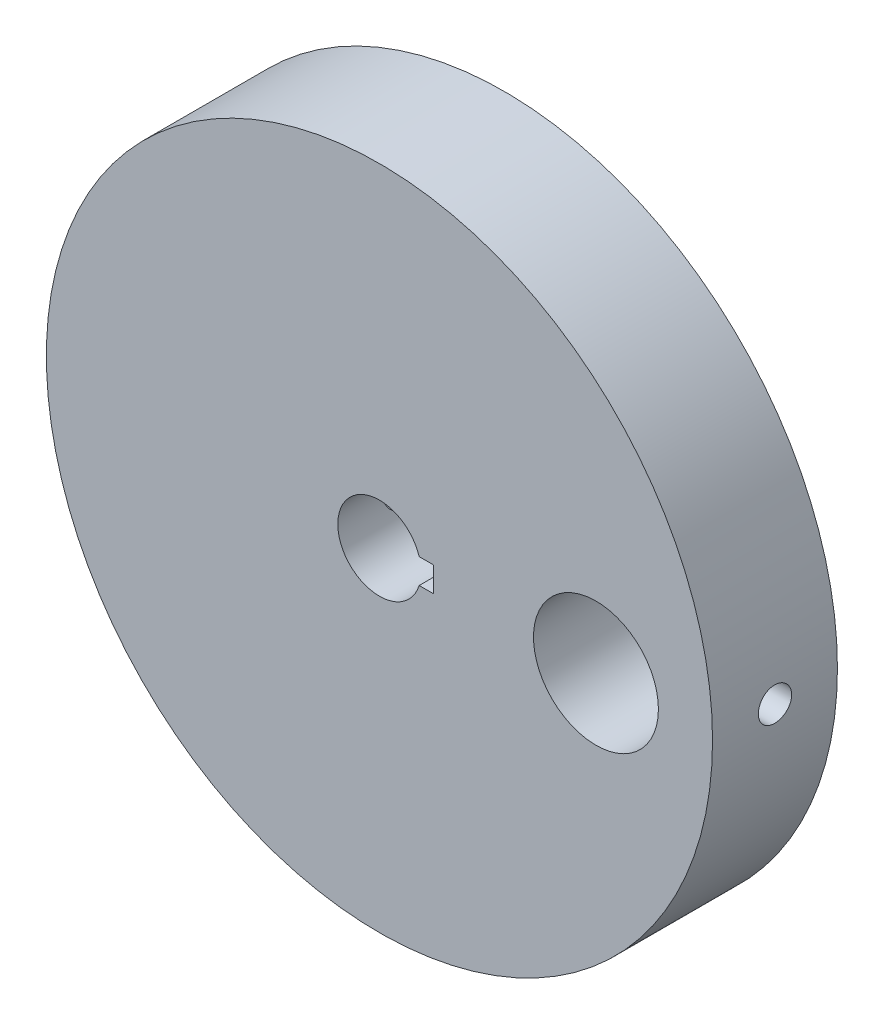
ISO-10303-21;
HEADER;
FILE_DESCRIPTION(('STEP AP214'),'2;1');
FILE_NAME('part.step','',(''),(''),'','','');
FILE_SCHEMA(('AUTOMOTIVE_DESIGN { 1 0 10303 214 1 1 1 1 }'));
ENDSEC;
DATA;
#1=APPLICATION_CONTEXT('core data for automotive mechanical design processes');
#2=APPLICATION_PROTOCOL_DEFINITION('international standard','automotive_design',2000,#1);
#3=PRODUCT_CONTEXT('',#1,'mechanical');
#4=PRODUCT('Part','Part','',(#3));
#5=PRODUCT_RELATED_PRODUCT_CATEGORY('part','',(#4));
#6=PRODUCT_DEFINITION_FORMATION('','',#4);
#7=PRODUCT_DEFINITION_CONTEXT('part definition',#1,'design');
#8=PRODUCT_DEFINITION('design','',#6,#7);
#9=PRODUCT_DEFINITION_SHAPE('','',#8);
#10=(LENGTH_UNIT() NAMED_UNIT(*) SI_UNIT(.MILLI.,.METRE.));
#11=(NAMED_UNIT(*) PLANE_ANGLE_UNIT() SI_UNIT($,.RADIAN.));
#12=(NAMED_UNIT(*) SI_UNIT($,.STERADIAN.) SOLID_ANGLE_UNIT());
#13=UNCERTAINTY_MEASURE_WITH_UNIT(LENGTH_MEASURE(1.E-05),#10,'distance_accuracy_value','');
#14=(GEOMETRIC_REPRESENTATION_CONTEXT(3) GLOBAL_UNCERTAINTY_ASSIGNED_CONTEXT((#13)) GLOBAL_UNIT_ASSIGNED_CONTEXT((#10,
#11,#12)) REPRESENTATION_CONTEXT('',''));
#15=CARTESIAN_POINT('',(0.,0.,0.));
#16=DIRECTION('',(0.,0.,1.));
#17=DIRECTION('',(1.,0.,0.));
#18=AXIS2_PLACEMENT_3D('',#15,#16,#17);
#19=CARTESIAN_POINT('',(0.,0.,7.5));
#20=DIRECTION('',(0.,0.,1.));
#21=DIRECTION('',(1.,0.,0.));
#22=AXIS2_PLACEMENT_3D('',#19,#20,#21);
#23=PLANE('',#22);
#24=CARTESIAN_POINT('',(0.,0.,7.5));
#25=DIRECTION('',(0.,0.,1.));
#26=DIRECTION('',(1.,0.,0.));
#27=AXIS2_PLACEMENT_3D('',#24,#25,#26);
#28=CIRCLE('',#27,40.);
#29=CARTESIAN_POINT('',(40.,0.,7.5));
#30=VERTEX_POINT('',#29);
#31=EDGE_CURVE('E11',#30,#30,#28,.T.);
#32=ORIENTED_EDGE('',*,*,#31,.T.);
#33=EDGE_LOOP('',(#32));
#34=FACE_BOUND('',#33,.T.);
#35=CARTESIAN_POINT('',(26.,0.,7.5));
#36=DIRECTION('',(0.,0.,1.));
#37=DIRECTION('',(1.,0.,0.));
#38=AXIS2_PLACEMENT_3D('',#35,#36,#37);
#39=CIRCLE('',#38,7.5);
#40=CARTESIAN_POINT('',(33.5,0.,7.5));
#41=VERTEX_POINT('',#40);
#42=EDGE_CURVE('E116',#41,#41,#39,.T.);
#43=ORIENTED_EDGE('',*,*,#42,.F.);
#44=EDGE_LOOP('',(#43));
#45=FACE_BOUND('',#44,.T.);
#46=DIRECTION('',(1.,0.,0.));
#47=VECTOR('',#46,1.);
#48=CARTESIAN_POINT('',(4.76969600708473,-1.5,7.5));
#49=LINE('',#48,#47);
#50=CARTESIAN_POINT('',(4.76969600708473,-1.5,7.5));
#51=VERTEX_POINT('',#50);
#52=CARTESIAN_POINT('',(6.5,-1.5,7.5));
#53=VERTEX_POINT('',#52);
#54=EDGE_CURVE('E86',#51,#53,#49,.T.);
#55=ORIENTED_EDGE('',*,*,#54,.F.);
#56=CARTESIAN_POINT('',(0.,0.,7.5));
#57=DIRECTION('',(0.,0.,1.));
#58=DIRECTION('',(1.,0.,0.));
#59=AXIS2_PLACEMENT_3D('',#56,#57,#58);
#60=CIRCLE('',#59,5.);
#61=CARTESIAN_POINT('',(4.76969600708473,1.5,7.5));
#62=VERTEX_POINT('',#61);
#63=EDGE_CURVE('E78',#62,#51,#60,.T.);
#64=ORIENTED_EDGE('',*,*,#63,.F.);
#65=DIRECTION('',(-1.,0.,0.));
#66=VECTOR('',#65,1.);
#67=CARTESIAN_POINT('',(4.76969600708473,1.5,7.5));
#68=LINE('',#67,#66);
#69=CARTESIAN_POINT('',(6.5,1.5,7.5));
#70=VERTEX_POINT('',#69);
#71=EDGE_CURVE('E100',#70,#62,#68,.T.);
#72=ORIENTED_EDGE('',*,*,#71,.F.);
#73=DIRECTION('',(0.,1.,0.));
#74=VECTOR('',#73,1.);
#75=CARTESIAN_POINT('',(6.5,1.5,7.5));
#76=LINE('',#75,#74);
#77=EDGE_CURVE('E98',#53,#70,#76,.T.);
#78=ORIENTED_EDGE('',*,*,#77,.F.);
#79=EDGE_LOOP('',(#55,#64,#72,#78));
#80=FACE_BOUND('',#79,.T.);
#81=ADVANCED_FACE('F37',(#34,#45,#80),#23,.T.);
#82=CARTESIAN_POINT('',(0.,0.,-7.5));
#83=DIRECTION('',(0.,0.,1.));
#84=DIRECTION('',(1.,0.,0.));
#85=AXIS2_PLACEMENT_3D('',#82,#83,#84);
#86=PLANE('',#85);
#87=CARTESIAN_POINT('',(26.,0.,-7.5));
#88=DIRECTION('',(0.,0.,1.));
#89=DIRECTION('',(1.,0.,0.));
#90=AXIS2_PLACEMENT_3D('',#87,#88,#89);
#91=CIRCLE('',#90,7.5);
#92=CARTESIAN_POINT('',(33.5,0.,-7.5));
#93=VERTEX_POINT('',#92);
#94=EDGE_CURVE('E94',#93,#93,#91,.T.);
#95=ORIENTED_EDGE('',*,*,#94,.T.);
#96=EDGE_LOOP('',(#95));
#97=FACE_BOUND('',#96,.T.);
#98=CARTESIAN_POINT('',(0.,0.,-7.5));
#99=DIRECTION('',(0.,0.,1.));
#100=DIRECTION('',(1.,0.,0.));
#101=AXIS2_PLACEMENT_3D('',#98,#99,#100);
#102=CIRCLE('',#101,40.);
#103=CARTESIAN_POINT('',(40.,0.,-7.5));
#104=VERTEX_POINT('',#103);
#105=EDGE_CURVE('E41',#104,#104,#102,.T.);
#106=ORIENTED_EDGE('',*,*,#105,.F.);
#107=EDGE_LOOP('',(#106));
#108=FACE_BOUND('',#107,.T.);
#109=CARTESIAN_POINT('',(0.,0.,-7.5));
#110=DIRECTION('',(0.,0.,1.));
#111=DIRECTION('',(1.,0.,0.));
#112=AXIS2_PLACEMENT_3D('',#109,#110,#111);
#113=CIRCLE('',#112,5.);
#114=CARTESIAN_POINT('',(4.76969600708473,1.5,-7.5));
#115=VERTEX_POINT('',#114);
#116=CARTESIAN_POINT('',(4.76969600708473,-1.5,-7.5));
#117=VERTEX_POINT('',#116);
#118=EDGE_CURVE('E60',#115,#117,#113,.T.);
#119=ORIENTED_EDGE('',*,*,#118,.T.);
#120=DIRECTION('',(1.,0.,0.));
#121=VECTOR('',#120,1.);
#122=CARTESIAN_POINT('',(4.76969600708473,-1.5,-7.5));
#123=LINE('',#122,#121);
#124=CARTESIAN_POINT('',(6.5,-1.5,-7.5));
#125=VERTEX_POINT('',#124);
#126=EDGE_CURVE('E93',#117,#125,#123,.T.);
#127=ORIENTED_EDGE('',*,*,#126,.T.);
#128=DIRECTION('',(0.,1.,0.));
#129=VECTOR('',#128,1.);
#130=CARTESIAN_POINT('',(6.5,1.5,-7.5));
#131=LINE('',#130,#129);
#132=CARTESIAN_POINT('',(6.5,1.5,-7.5));
#133=VERTEX_POINT('',#132);
#134=EDGE_CURVE('E108',#125,#133,#131,.T.);
#135=ORIENTED_EDGE('',*,*,#134,.T.);
#136=DIRECTION('',(-1.,0.,0.));
#137=VECTOR('',#136,1.);
#138=CARTESIAN_POINT('',(4.76969600708473,1.5,-7.5));
#139=LINE('',#138,#137);
#140=EDGE_CURVE('E87',#133,#115,#139,.T.);
#141=ORIENTED_EDGE('',*,*,#140,.T.);
#142=EDGE_LOOP('',(#119,#127,#135,#141));
#143=FACE_BOUND('',#142,.T.);
#144=ADVANCED_FACE('F122',(#97,#108,#143),#86,.F.);
#145=CARTESIAN_POINT('',(0.,0.,7.5));
#146=DIRECTION('',(0.,0.,-1.));
#147=DIRECTION('',(-1.,0.,0.));
#148=AXIS2_PLACEMENT_3D('',#145,#146,#147);
#149=CYLINDRICAL_SURFACE('',#148,40.);
#150=CARTESIAN_POINT('',(40.,0.,-2.));
#151=CARTESIAN_POINT('',(39.9999993310588,0.11226561691105,-1.99999504538615));
#152=CARTESIAN_POINT('',(39.9995223042568,0.224610849133381,-1.99051557564883));
#153=CARTESIAN_POINT('',(39.9976652092002,0.446202106970098,-1.95283452638573));
#154=CARTESIAN_POINT('',(39.9962840769828,0.555444322678374,-1.9246108879087));
#155=CARTESIAN_POINT('',(39.992775092088,0.767587516754,-1.85025159445374));
#156=CARTESIAN_POINT('',(39.9906476200151,0.870491695889498,-1.80412506798111));
#157=CARTESIAN_POINT('',(39.9858855602204,1.0670687455838,-1.69528338707365));
#158=CARTESIAN_POINT('',(39.9832510922494,1.16074378814924,-1.63257214858503));
#159=CARTESIAN_POINT('',(39.9777684271073,1.33632598574583,-1.49227065592492));
#160=CARTESIAN_POINT('',(39.9749200431171,1.41822266811323,-1.41466730185758));
#161=CARTESIAN_POINT('',(39.9693321871038,1.5678341577616,-1.24681060199339));
#162=CARTESIAN_POINT('',(39.9665927195335,1.63554838571451,-1.15655673969704));
#163=CARTESIAN_POINT('',(39.9615302934698,1.7549016777892,-0.965906067970409));
#164=CARTESIAN_POINT('',(39.9592075471121,1.80653256433003,-0.865504132997755));
#165=CARTESIAN_POINT('',(39.955242768929,1.89220109729626,-0.65744343680083));
#166=CARTESIAN_POINT('',(39.9536007319379,1.92623887723075,-0.549784730653147));
#167=CARTESIAN_POINT('',(39.9511842296725,1.97572732304413,-0.330362859784814));
#168=CARTESIAN_POINT('',(39.9504090331057,1.99119365716441,-0.218603237064505));
#169=CARTESIAN_POINT('',(39.9498114333411,2.00314852073654,0.00592844814012249));
#170=CARTESIAN_POINT('',(39.9499890226245,1.99963719995224,0.118700502627734));
#171=CARTESIAN_POINT('',(39.9512762883718,1.97374948002459,0.34194936579843));
#172=CARTESIAN_POINT('',(39.9523851283809,1.95139001033192,0.452428143095313));
#173=CARTESIAN_POINT('',(39.9554086009528,1.88846693076793,0.668062228076361));
#174=CARTESIAN_POINT('',(39.9573232369206,1.84790324397276,0.773217513263452));
#175=CARTESIAN_POINT('',(39.9617434692129,1.74970385104569,0.975274177458255));
#176=CARTESIAN_POINT('',(39.964249332606,1.69206042665314,1.07217179931805));
#177=CARTESIAN_POINT('',(39.9695693120198,1.56134346775137,1.25492147338856));
#178=CARTESIAN_POINT('',(39.9723834302158,1.48826982434795,1.340773447641));
#179=CARTESIAN_POINT('',(39.9780064583275,1.32867118390875,1.49909333988779));
#180=CARTESIAN_POINT('',(39.9808153591497,1.2421315263715,1.57154648011625));
#181=CARTESIAN_POINT('',(39.9861083898038,1.05810892523511,1.70089815116366));
#182=CARTESIAN_POINT('',(39.9885925195558,0.960625978944194,1.75779667815655));
#183=CARTESIAN_POINT('',(39.9929561517216,0.757475340353877,1.85442256444626));
#184=CARTESIAN_POINT('',(39.9948356359779,0.651807402377383,1.89414940808973));
#185=CARTESIAN_POINT('',(39.9977778913425,0.435290141698448,1.95529456859931));
#186=CARTESIAN_POINT('',(39.9988406685649,0.324440857791478,1.97671302252685));
#187=CARTESIAN_POINT('',(40.0000289471006,0.10083580144197,2.00061519849716));
#188=CARTESIAN_POINT('',(40.0001554602116,-0.0119177809093568,2.00311936081388));
#189=CARTESIAN_POINT('',(39.999459638582,-0.236243547534332,1.98917521186804));
#190=CARTESIAN_POINT('',(39.9986373069794,-0.34781573571399,1.97272696328704));
#191=CARTESIAN_POINT('',(39.9961370686925,-0.566554310425217,1.92136181610515));
#192=CARTESIAN_POINT('',(39.9944595943818,-0.673722893926904,1.88645425049423));
#193=CARTESIAN_POINT('',(39.9904379315506,-0.880679810996354,1.79917082958777));
#194=CARTESIAN_POINT('',(39.9880937391924,-0.980468102077103,1.7467948737394));
#195=CARTESIAN_POINT('',(39.9829998301834,-1.16992566379311,1.62600910232764));
#196=CARTESIAN_POINT('',(39.9802497677389,-1.25958618962161,1.55758558496262));
#197=CARTESIAN_POINT('',(39.9746549811857,-1.42615516033646,1.40666700230576));
#198=CARTESIAN_POINT('',(39.9718102564698,-1.5030635234061,1.3241718467385));
#199=CARTESIAN_POINT('',(39.9663438905463,-1.6420138362136,1.14736379161289));
#200=CARTESIAN_POINT('',(39.9637224491183,-1.7040425608833,1.05304049169613));
#201=CARTESIAN_POINT('',(39.959001397661,-1.81138243847188,0.855306194288842));
#202=CARTESIAN_POINT('',(39.9569017853607,-1.85669366414683,0.751895236351049));
#203=CARTESIAN_POINT('',(39.9534625815024,-1.92928926590117,0.538970076618248));
#204=CARTESIAN_POINT('',(39.9521226345294,-1.95658207301354,0.429458755304835));
#205=CARTESIAN_POINT('',(39.950352862787,-1.9923936702811,0.207401181315983));
#206=CARTESIAN_POINT('',(39.9499230328505,-2.00091256702397,0.0948549458747469));
#207=CARTESIAN_POINT('',(39.950022094605,-1.99893350883704,-0.12994603152679));
#208=CARTESIAN_POINT('',(39.9505499374029,-1.98845635938041,-0.242200957708285));
#209=CARTESIAN_POINT('',(39.9525026363605,-1.94882562334041,-0.463355977302741));
#210=CARTESIAN_POINT('',(39.9539274942299,-1.91967200116263,-0.572256064321494));
#211=CARTESIAN_POINT('',(39.957513394848,-1.84352013202289,-0.783614493192754));
#212=CARTESIAN_POINT('',(39.9596744429994,-1.79652175410203,-0.886072787763866));
#213=CARTESIAN_POINT('',(39.9644890892628,-1.68601807913173,-1.08164576679497));
#214=CARTESIAN_POINT('',(39.9671426722612,-1.62251328855579,-1.17476073781877));
#215=CARTESIAN_POINT('',(39.9726466213336,-1.48072496730499,-1.34910778902925));
#216=CARTESIAN_POINT('',(39.975497178751,-1.40242693454728,-1.43032806876016));
#217=CARTESIAN_POINT('',(39.9810724487546,-1.23328423979641,-1.57849671929589));
#218=CARTESIAN_POINT('',(39.983797130209,-1.14243649593039,-1.6454415741354));
#219=CARTESIAN_POINT('',(39.9888155046257,-0.950701902619181,-1.76319036062269));
#220=CARTESIAN_POINT('',(39.9911087821283,-0.849805517457556,-1.81397876513819));
#221=CARTESIAN_POINT('',(39.9949997208313,-0.640981745076911,-1.89783391708306));
#222=CARTESIAN_POINT('',(39.9965982032403,-0.533062832578585,-1.93092159651));
#223=CARTESIAN_POINT('',(39.9984966404118,-0.353727852036427,-1.96975709699893));
#224=CARTESIAN_POINT('',(39.9990579226621,-0.28347336561693,-1.98108370648269));
#225=CARTESIAN_POINT('',(39.9998098141077,-0.142156561677924,-1.99620672357028));
#226=CARTESIAN_POINT('',(40.0000004236192,-0.0710942448477627,-2.00000313759938));
#227=CARTESIAN_POINT('',(40.,0.,-2.));
#228=B_SPLINE_CURVE_WITH_KNOTS('',3,(#150,#151,#152,#153,#154,#155,#156,#157,#158,#159,#160,
#161,#162,#163,#164,#165,#166,#167,#168,#169,#170,#171,#172,#173,#174,#175,#176,#177,#178,#179,
#180,#181,#182,#183,#184,#185,#186,#187,#188,#189,#190,#191,#192,#193,#194,#195,#196,#197,#198,
#199,#200,#201,#202,#203,#204,#205,#206,#207,#208,#209,#210,#211,#212,#213,#214,#215,#216,#217,
#218,#219,#220,#221,#222,#223,#224,#225,#226,#227),.UNSPECIFIED.,.T.,.F.,(4,2,2,2,2,2,2,2,2,2,2,
2,2,2,2,2,2,2,2,2,2,2,2,2,2,2,2,2,2,2,2,2,2,2,2,2,2,2,4),(0.,0.336537330208493,
0.673471415625031,1.0102339269084,1.34691699344225,1.68389759324273,2.02089195541841,
2.35805738387917,2.69522025364952,3.03209846764322,3.36897402313642,3.70554731824559,
4.04212203559462,4.37884908219658,4.71557850522954,5.05267712546197,5.38977582861241,
5.7268846538922,6.06399095546453,6.40073290120862,6.73747373324478,7.07404447241389,
7.41061714900934,7.74747825258439,8.08434151734546,8.42150308697864,8.75866318923709,
9.09566541823679,9.43266573392305,9.76929717200414,10.1059292516535,10.4425638018228,
10.7791880241058,11.1161439737318,11.4531828183021,11.790544601777,12.1275065511194,
12.3406251214153,12.5537435098637),.UNSPECIFIED.);
#229=CARTESIAN_POINT('',(40.,0.,-2.));
#230=VERTEX_POINT('',#229);
#231=EDGE_CURVE('E240',#230,#230,#228,.T.);
#232=ORIENTED_EDGE('',*,*,#231,.F.);
#233=EDGE_LOOP('',(#232));
#234=FACE_BOUND('',#233,.T.);
#235=CARTESIAN_POINT('',(-40.,0.,-2.));
#236=CARTESIAN_POINT('',(-39.9999993310588,-0.11226561691105,-1.99999504538615));
#237=CARTESIAN_POINT('',(-39.9995223042567,-0.224610849133381,-1.99051557564883));
#238=CARTESIAN_POINT('',(-39.9976652092002,-0.446202106970098,-1.95283452638573));
#239=CARTESIAN_POINT('',(-39.9962840769828,-0.555444322678374,-1.9246108879087));
#240=CARTESIAN_POINT('',(-39.992775092088,-0.767587516754001,-1.85025159445374));
#241=CARTESIAN_POINT('',(-39.9906476200151,-0.870491695889498,-1.80412506798111));
#242=CARTESIAN_POINT('',(-39.9858855602204,-1.0670687455838,-1.69528338707365));
#243=CARTESIAN_POINT('',(-39.9832510922494,-1.16074378814924,-1.63257214858503));
#244=CARTESIAN_POINT('',(-39.9777684271073,-1.33632598574583,-1.49227065592492));
#245=CARTESIAN_POINT('',(-39.9749200431171,-1.41822266811323,-1.41466730185758));
#246=CARTESIAN_POINT('',(-39.9693321871038,-1.5678341577616,-1.24681060199339));
#247=CARTESIAN_POINT('',(-39.9665927195335,-1.63554838571451,-1.15655673969704));
#248=CARTESIAN_POINT('',(-39.9615302934698,-1.7549016777892,-0.965906067970409));
#249=CARTESIAN_POINT('',(-39.9592075471121,-1.80653256433003,-0.865504132997755));
#250=CARTESIAN_POINT('',(-39.955242768929,-1.89220109729626,-0.65744343680083));
#251=CARTESIAN_POINT('',(-39.9536007319379,-1.92623887723075,-0.549784730653147));
#252=CARTESIAN_POINT('',(-39.9511842296725,-1.97572732304413,-0.330362859784814));
#253=CARTESIAN_POINT('',(-39.9504090331057,-1.99119365716441,-0.218603237064504));
#254=CARTESIAN_POINT('',(-39.9498114333411,-2.00314852073654,0.00592844814012289));
#255=CARTESIAN_POINT('',(-39.9499890226245,-1.99963719995224,0.118700502627734));
#256=CARTESIAN_POINT('',(-39.9512762883718,-1.97374948002459,0.34194936579843));
#257=CARTESIAN_POINT('',(-39.9523851283809,-1.95139001033192,0.452428143095313));
#258=CARTESIAN_POINT('',(-39.9554086009528,-1.88846693076793,0.668062228076361));
#259=CARTESIAN_POINT('',(-39.9573232369206,-1.84790324397276,0.773217513263452));
#260=CARTESIAN_POINT('',(-39.9617434692129,-1.74970385104569,0.975274177458256));
#261=CARTESIAN_POINT('',(-39.964249332606,-1.69206042665314,1.07217179931805));
#262=CARTESIAN_POINT('',(-39.9695693120198,-1.56134346775137,1.25492147338856));
#263=CARTESIAN_POINT('',(-39.9723834302158,-1.48826982434795,1.340773447641));
#264=CARTESIAN_POINT('',(-39.9780064583275,-1.32867118390875,1.49909333988779));
#265=CARTESIAN_POINT('',(-39.9808153591497,-1.2421315263715,1.57154648011625));
#266=CARTESIAN_POINT('',(-39.9861083898038,-1.05810892523511,1.70089815116366));
#267=CARTESIAN_POINT('',(-39.9885925195558,-0.960625978944193,1.75779667815655));
#268=CARTESIAN_POINT('',(-39.9929561517216,-0.757475340353877,1.85442256444626));
#269=CARTESIAN_POINT('',(-39.9948356359779,-0.651807402377383,1.89414940808973));
#270=CARTESIAN_POINT('',(-39.9977778913425,-0.435290141698448,1.95529456859931));
#271=CARTESIAN_POINT('',(-39.9988406685649,-0.324440857791477,1.97671302252685));
#272=CARTESIAN_POINT('',(-40.0000289471006,-0.10083580144197,2.00061519849715));
#273=CARTESIAN_POINT('',(-40.0001554602116,0.0119177809093572,2.00311936081388));
#274=CARTESIAN_POINT('',(-39.999459638582,0.236243547534333,1.98917521186804));
#275=CARTESIAN_POINT('',(-39.9986373069794,0.34781573571399,1.97272696328704));
#276=CARTESIAN_POINT('',(-39.9961370686925,0.566554310425216,1.92136181610515));
#277=CARTESIAN_POINT('',(-39.9944595943818,0.673722893926903,1.88645425049423));
#278=CARTESIAN_POINT('',(-39.9904379315506,0.880679810996354,1.79917082958777));
#279=CARTESIAN_POINT('',(-39.9880937391924,0.980468102077103,1.7467948737394));
#280=CARTESIAN_POINT('',(-39.9829998301834,1.16992566379311,1.62600910232764));
#281=CARTESIAN_POINT('',(-39.9802497677389,1.25958618962161,1.55758558496262));
#282=CARTESIAN_POINT('',(-39.9746549811857,1.42615516033646,1.40666700230576));
#283=CARTESIAN_POINT('',(-39.9718102564698,1.5030635234061,1.3241718467385));
#284=CARTESIAN_POINT('',(-39.9663438905463,1.6420138362136,1.14736379161289));
#285=CARTESIAN_POINT('',(-39.9637224491183,1.7040425608833,1.05304049169613));
#286=CARTESIAN_POINT('',(-39.959001397661,1.81138243847188,0.855306194288841));
#287=CARTESIAN_POINT('',(-39.9569017853607,1.85669366414683,0.751895236351049));
#288=CARTESIAN_POINT('',(-39.9534625815024,1.92928926590117,0.538970076618248));
#289=CARTESIAN_POINT('',(-39.9521226345294,1.95658207301354,0.429458755304835));
#290=CARTESIAN_POINT('',(-39.950352862787,1.9923936702811,0.207401181315983));
#291=CARTESIAN_POINT('',(-39.9499230328505,2.00091256702397,0.0948549458747464));
#292=CARTESIAN_POINT('',(-39.950022094605,1.99893350883704,-0.129946031526791));
#293=CARTESIAN_POINT('',(-39.9505499374029,1.98845635938041,-0.242200957708286));
#294=CARTESIAN_POINT('',(-39.9525026363605,1.94882562334041,-0.463355977302742));
#295=CARTESIAN_POINT('',(-39.9539274942299,1.91967200116263,-0.572256064321495));
#296=CARTESIAN_POINT('',(-39.957513394848,1.84352013202289,-0.783614493192754));
#297=CARTESIAN_POINT('',(-39.9596744429994,1.79652175410203,-0.886072787763866));
#298=CARTESIAN_POINT('',(-39.9644890892628,1.68601807913173,-1.08164576679497));
#299=CARTESIAN_POINT('',(-39.9671426722612,1.62251328855578,-1.17476073781877));
#300=CARTESIAN_POINT('',(-39.9726466213336,1.48072496730499,-1.34910778902925));
#301=CARTESIAN_POINT('',(-39.975497178751,1.40242693454728,-1.43032806876016));
#302=CARTESIAN_POINT('',(-39.9810724487546,1.23328423979641,-1.57849671929589));
#303=CARTESIAN_POINT('',(-39.983797130209,1.14243649593039,-1.6454415741354));
#304=CARTESIAN_POINT('',(-39.9888155046257,0.950701902619181,-1.76319036062269));
#305=CARTESIAN_POINT('',(-39.9911087821283,0.849805517457556,-1.81397876513819));
#306=CARTESIAN_POINT('',(-39.9949997208313,0.640981745076911,-1.89783391708306));
#307=CARTESIAN_POINT('',(-39.9965982032403,0.533062832578585,-1.93092159651));
#308=CARTESIAN_POINT('',(-39.9984966404118,0.353727852036427,-1.96975709699893));
#309=CARTESIAN_POINT('',(-39.9990579226621,0.28347336561693,-1.98108370648269));
#310=CARTESIAN_POINT('',(-39.9998098141077,0.142156561677924,-1.99620672357028));
#311=CARTESIAN_POINT('',(-40.0000004236192,0.0710942448477627,-2.00000313759938));
#312=CARTESIAN_POINT('',(-40.,0.,-2.));
#313=B_SPLINE_CURVE_WITH_KNOTS('',3,(#235,#236,#237,#238,#239,#240,#241,#242,#243,#244,#245,
#246,#247,#248,#249,#250,#251,#252,#253,#254,#255,#256,#257,#258,#259,#260,#261,#262,#263,#264,
#265,#266,#267,#268,#269,#270,#271,#272,#273,#274,#275,#276,#277,#278,#279,#280,#281,#282,#283,
#284,#285,#286,#287,#288,#289,#290,#291,#292,#293,#294,#295,#296,#297,#298,#299,#300,#301,#302,
#303,#304,#305,#306,#307,#308,#309,#310,#311,#312),.UNSPECIFIED.,.T.,.F.,(4,2,2,2,2,2,2,2,2,2,2,
2,2,2,2,2,2,2,2,2,2,2,2,2,2,2,2,2,2,2,2,2,2,2,2,2,2,2,4),(0.,0.336537330208493,
0.673471415625031,1.0102339269084,1.34691699344225,1.68389759324273,2.02089195541841,
2.35805738387917,2.69522025364952,3.03209846764322,3.36897402313642,3.70554731824559,
4.04212203559462,4.37884908219658,4.71557850522954,5.05267712546197,5.38977582861241,
5.72688465389219,6.06399095546453,6.40073290120862,6.73747373324478,7.07404447241389,
7.41061714900934,7.74747825258439,8.08434151734545,8.42150308697864,8.75866318923709,
9.09566541823679,9.43266573392305,9.76929717200414,10.1059292516535,10.4425638018228,
10.7791880241058,11.1161439737318,11.4531828183021,11.790544601777,12.1275065511194,
12.3406251214153,12.5537435098637),.UNSPECIFIED.);
#314=CARTESIAN_POINT('',(-40.,0.,-2.));
#315=VERTEX_POINT('',#314);
#316=EDGE_CURVE('E106',#315,#315,#313,.T.);
#317=ORIENTED_EDGE('',*,*,#316,.F.);
#318=EDGE_LOOP('',(#317));
#319=FACE_BOUND('',#318,.T.);
#320=ORIENTED_EDGE('',*,*,#31,.F.);
#321=EDGE_LOOP('',(#320));
#322=FACE_BOUND('',#321,.T.);
#323=ORIENTED_EDGE('',*,*,#105,.T.);
#324=EDGE_LOOP('',(#323));
#325=FACE_BOUND('',#324,.T.);
#326=ADVANCED_FACE('F39',(#234,#319,#322,#325),#149,.T.);
#327=CARTESIAN_POINT('',(26.,0.,7.5));
#328=DIRECTION('',(0.,0.,-1.));
#329=DIRECTION('',(-1.,0.,0.));
#330=AXIS2_PLACEMENT_3D('',#327,#328,#329);
#331=CYLINDRICAL_SURFACE('',#330,7.5);
#332=CARTESIAN_POINT('',(33.5,0.,-2.));
#333=CARTESIAN_POINT('',(33.4999983381016,0.110254555832854,-1.99999738306515));
#334=CARTESIAN_POINT('',(33.4975448616215,0.220537160221841,-1.99085238581033));
#335=CARTESIAN_POINT('',(33.4879957362166,0.437925451354464,-1.95457876926131));
#336=CARTESIAN_POINT('',(33.4808978533259,0.545029583319086,-1.92744149557388));
#337=CARTESIAN_POINT('',(33.4628433325279,0.752891589045312,-1.85612833313597));
#338=CARTESIAN_POINT('',(33.4518916713038,0.853657451015285,-1.81197441233398));
#339=CARTESIAN_POINT('',(33.4272869915168,1.04635368639266,-1.70796275733338));
#340=CARTESIAN_POINT('',(33.4136337929518,1.13828347044963,-1.64810397664071));
#341=CARTESIAN_POINT('',(33.3847461490199,1.31282950374002,-1.51291648358663));
#342=CARTESIAN_POINT('',(33.3694846767868,1.39521168986279,-1.43729133199174));
#343=CARTESIAN_POINT('',(33.3392740967959,1.54628713660638,-1.27335151693664));
#344=CARTESIAN_POINT('',(33.3243250294724,1.61497863495664,-1.18503522238247));
#345=CARTESIAN_POINT('',(33.2961553746437,1.73786409243415,-0.99635176517455));
#346=CARTESIAN_POINT('',(33.2829688856324,1.79178877736487,-0.895803671738271));
#347=CARTESIAN_POINT('',(33.2602147731819,1.88187548076994,-0.686659888907574));
#348=CARTESIAN_POINT('',(33.2506464825326,1.91804077451369,-0.578065687668561));
#349=CARTESIAN_POINT('',(33.236491158024,1.97076920226504,-0.358504462174985));
#350=CARTESIAN_POINT('',(33.2317964781149,1.98775670244692,-0.247646460069263));
#351=CARTESIAN_POINT('',(33.2275983091637,2.0029703470582,-0.0245623166934598));
#352=CARTESIAN_POINT('',(33.2280938501445,2.00119999705753,0.0876635650240692));
#353=CARTESIAN_POINT('',(33.2341237880203,1.97928510002699,0.306985415374063));
#354=CARTESIAN_POINT('',(33.2395173551153,1.95965406064765,0.414137182038488));
#355=CARTESIAN_POINT('',(33.2545101308069,1.90339748722183,0.623568334456244));
#356=CARTESIAN_POINT('',(33.2641096755261,1.86677059492995,0.725847330075347));
#357=CARTESIAN_POINT('',(33.2865566174839,1.77714356965256,0.923968143808577));
#358=CARTESIAN_POINT('',(33.299439428187,1.72396341137784,1.01972433928626));
#359=CARTESIAN_POINT('',(33.3269822964245,1.60286503823778,1.20113415885152));
#360=CARTESIAN_POINT('',(33.3416427035519,1.53494392224251,1.28678578915647));
#361=CARTESIAN_POINT('',(33.3716751062986,1.38366607263419,1.4484889974548));
#362=CARTESIAN_POINT('',(33.3870547148883,1.29987812728299,1.52413631831495));
#363=CARTESIAN_POINT('',(33.4163638127632,1.12061766820637,1.66038878035029));
#364=CARTESIAN_POINT('',(33.4302932448855,1.02514469420509,1.72099332870243));
#365=CARTESIAN_POINT('',(33.4552182039829,0.82459825549745,1.82561790282465));
#366=CARTESIAN_POINT('',(33.4662007283356,0.719484902551788,1.86956477044859));
#367=CARTESIAN_POINT('',(33.48390044401,0.503002294390394,1.93904718881337));
#368=CARTESIAN_POINT('',(33.4906185673375,0.391634411928322,1.96458676272396));
#369=CARTESIAN_POINT('',(33.4988915855838,0.169254083145514,1.99589487691783));
#370=CARTESIAN_POINT('',(33.5005899747096,0.0583242376413792,2.00221303985087));
#371=CARTESIAN_POINT('',(33.4990447169169,-0.1630100459012,1.99641683575306));
#372=CARTESIAN_POINT('',(33.4958015808035,-0.273414537062115,1.98430437389423));
#373=CARTESIAN_POINT('',(33.4848303549602,-0.488602449901781,1.94244155254002));
#374=CARTESIAN_POINT('',(33.4771802654633,-0.593449852027784,1.91299775380223));
#375=CARTESIAN_POINT('',(33.4582629489414,-0.796706971176066,1.83766405549205));
#376=CARTESIAN_POINT('',(33.4469953299616,-0.895115989216029,1.79177237374945));
#377=CARTESIAN_POINT('',(33.4217566055953,-1.08483847466795,1.68382611281946));
#378=CARTESIAN_POINT('',(33.4077368660496,-1.17597518846118,1.62147253320226));
#379=CARTESIAN_POINT('',(33.3786145236556,-1.34668463539715,1.48274836984201));
#380=CARTESIAN_POINT('',(33.3635117072752,-1.42625507879918,1.40637501739894));
#381=CARTESIAN_POINT('',(33.3333974586671,-1.57388924478774,1.23921442250544));
#382=CARTESIAN_POINT('',(33.3184006142931,-1.64156519249816,1.14808143860483));
#383=CARTESIAN_POINT('',(33.2906644718273,-1.76067191185118,0.955435303900378));
#384=CARTESIAN_POINT('',(33.2779250795632,-1.81210336122161,0.853922586377695));
#385=CARTESIAN_POINT('',(33.2562926837321,-1.89687411586112,0.643904692923895));
#386=CARTESIAN_POINT('',(33.2473774831801,-1.93031812253958,0.535444188182422));
#387=CARTESIAN_POINT('',(33.234398251268,-1.97841205118791,0.314160680325248));
#388=CARTESIAN_POINT('',(33.2303329802001,-1.99306677602478,0.201338799652083));
#389=CARTESIAN_POINT('',(33.2276174457359,-2.00288989653714,-0.0214947878837966));
#390=CARTESIAN_POINT('',(33.2287939774324,-1.99868155618109,-0.131477320258286));
#391=CARTESIAN_POINT('',(33.2360239608109,-1.97234376000439,-0.349103514010029));
#392=CARTESIAN_POINT('',(33.2420772869944,-1.95021476535025,-0.456747235500577));
#393=CARTESIAN_POINT('',(33.2582757107316,-1.88902515699699,-0.665855752129848));
#394=CARTESIAN_POINT('',(33.2683888501964,-1.8500966107558,-0.767361842732185));
#395=CARTESIAN_POINT('',(33.2915681813618,-1.75651554562386,-0.962478830534143));
#396=CARTESIAN_POINT('',(33.3046348362136,-1.70186056024617,-1.05608848630049));
#397=CARTESIAN_POINT('',(33.3327292144046,-1.57648909268817,-1.23573035949662));
#398=CARTESIAN_POINT('',(33.3478033310169,-1.50534729767909,-1.32145853497621));
#399=CARTESIAN_POINT('',(33.3779550378301,-1.349830535111,-1.47996245166733));
#400=CARTESIAN_POINT('',(33.3930326279844,-1.26545235435874,-1.55273503866884));
#401=CARTESIAN_POINT('',(33.4218781240397,-1.08367998108868,-1.68479223764686));
#402=CARTESIAN_POINT('',(33.4356111131455,-0.986045961751777,-1.74375501064933));
#403=CARTESIAN_POINT('',(33.459838101029,-0.781888640416887,-1.84433741592936));
#404=CARTESIAN_POINT('',(33.4703341768359,-0.675371094696295,-1.8859681756636));
#405=CARTESIAN_POINT('',(33.4855475251347,-0.474374704880989,-1.94527528541552));
#406=CARTESIAN_POINT('',(33.490927705926,-0.380762016565034,-1.9657493835925));
#407=CARTESIAN_POINT('',(33.4981544903646,-0.191439795317075,-1.99311220616706));
#408=CARTESIAN_POINT('',(33.5000014429727,-0.0957304704048599,-2.00000227220002));
#409=CARTESIAN_POINT('',(33.5,0.,-2.));
#410=B_SPLINE_CURVE_WITH_KNOTS('',3,(#332,#333,#334,#335,#336,#337,#338,#339,#340,#341,#342,
#343,#344,#345,#346,#347,#348,#349,#350,#351,#352,#353,#354,#355,#356,#357,#358,#359,#360,#361,
#362,#363,#364,#365,#366,#367,#368,#369,#370,#371,#372,#373,#374,#375,#376,#377,#378,#379,#380,
#381,#382,#383,#384,#385,#386,#387,#388,#389,#390,#391,#392,#393,#394,#395,#396,#397,#398,#399,
#400,#401,#402,#403,#404,#405,#406,#407,#408,#409),.UNSPECIFIED.,.T.,.F.,(4,2,2,2,2,2,2,2,2,2,2,
2,2,2,2,2,2,2,2,2,2,2,2,2,2,2,2,2,2,2,2,2,2,2,2,2,2,2,4),(0.,0.330412598949569,0.66098424376145,
0.991130552971933,1.32129886708675,1.65834897954967,1.99544244925149,2.33832582523229,
2.681145941297,3.01622158250468,3.3512346040432,3.67691002045997,4.0026114681294,
4.33198673346498,4.6614268811763,5.00161259812322,5.34181171937597,5.68348809603041,
6.02508977190139,6.35682717524547,6.68853028925351,7.01453535642116,7.34057575775615,
7.6730028600455,8.00549568258887,8.34736496382788,8.68921998024107,9.02906297699386,
9.36881908663983,9.69743342403611,10.0260393052059,10.352107654483,10.67822717123,
11.0139433957139,11.3497412433245,11.692722522809,12.0354832614518,12.3223981899334,
12.6092847796638),.UNSPECIFIED.);
#411=CARTESIAN_POINT('',(33.5,0.,-2.));
#412=VERTEX_POINT('',#411);
#413=EDGE_CURVE('E246',#412,#412,#410,.T.);
#414=ORIENTED_EDGE('',*,*,#413,.T.);
#415=EDGE_LOOP('',(#414));
#416=FACE_BOUND('',#415,.T.);
#417=ORIENTED_EDGE('',*,*,#42,.T.);
#418=EDGE_LOOP('',(#417));
#419=FACE_BOUND('',#418,.T.);
#420=ORIENTED_EDGE('',*,*,#94,.F.);
#421=EDGE_LOOP('',(#420));
#422=FACE_BOUND('',#421,.T.);
#423=ADVANCED_FACE('F125',(#416,#419,#422),#331,.F.);
#424=CARTESIAN_POINT('',(0.,0.,7.5));
#425=DIRECTION('',(0.,0.,-1.));
#426=DIRECTION('',(-1.,0.,0.));
#427=AXIS2_PLACEMENT_3D('',#424,#425,#426);
#428=CYLINDRICAL_SURFACE('',#427,5.);
#429=CARTESIAN_POINT('',(-5.,0.,-2.));
#430=CARTESIAN_POINT('',(-4.99999271227085,-0.107493005442891,-1.99999014817627));
#431=CARTESIAN_POINT('',(-4.99649294306933,-0.215172564090673,-1.99128224791162));
#432=CARTESIAN_POINT('',(-4.98283453100642,-0.427496480417896,-1.95675229647876));
#433=CARTESIAN_POINT('',(-4.97265778698877,-0.532131777561248,-1.93088372091387));
#434=CARTESIAN_POINT('',(-4.94674209213119,-0.734953922727403,-1.86312392194117));
#435=CARTESIAN_POINT('',(-4.93102136364072,-0.833160661616959,-1.82128515378327));
#436=CARTESIAN_POINT('',(-4.89556610796078,-1.02107197032837,-1.72298082667345));
#437=CARTESIAN_POINT('',(-4.87583297458057,-1.11077947675099,-1.66652034508107));
#438=CARTESIAN_POINT('',(-4.83330886170419,-1.28350100757039,-1.53776450143906));
#439=CARTESIAN_POINT('',(-4.81042296929191,-1.36606227255021,-1.46489334375974));
#440=CARTESIAN_POINT('',(-4.76460576906195,-1.51817500478472,-1.30659999652322));
#441=CARTESIAN_POINT('',(-4.74167444453792,-1.58772010713353,-1.22117170278826));
#442=CARTESIAN_POINT('',(-4.69722791797136,-1.71487456729288,-1.03557192975773));
#443=CARTESIAN_POINT('',(-4.67582115964951,-1.77181498119547,-0.934913513976802));
#444=CARTESIAN_POINT('',(-4.63833647186793,-1.86775471903715,-0.724463601579958));
#445=CARTESIAN_POINT('',(-4.62225601244176,-1.90676256428583,-0.614676472151639));
#446=CARTESIAN_POINT('',(-4.59826357660818,-1.96389882339587,-0.394287666407897));
#447=CARTESIAN_POINT('',(-4.59001420355605,-1.98289396580565,-0.283948764423787));
#448=CARTESIAN_POINT('',(-4.58164004049144,-2.00217296164003,-0.0613650016927321));
#449=CARTESIAN_POINT('',(-4.58151125522768,-2.00246601631322,0.0508788946250151));
#450=CARTESIAN_POINT('',(-4.58910500279994,-1.98498936750454,0.265756671458044));
#451=CARTESIAN_POINT('',(-4.5962817503845,-1.96847531430514,0.368515714409031));
#452=CARTESIAN_POINT('',(-4.61676187607836,-1.91994688029782,0.569659556006714));
#453=CARTESIAN_POINT('',(-4.63006632321673,-1.88792979480463,0.668043588110308));
#454=CARTESIAN_POINT('',(-4.6615948508853,-1.80869473255107,0.860017836196041));
#455=CARTESIAN_POINT('',(-4.67991379280788,-1.76117986231532,0.95346923905469));
#456=CARTESIAN_POINT('',(-4.7193811638989,-1.65250646073221,1.13141581636156));
#457=CARTESIAN_POINT('',(-4.74053065456849,-1.59134280510084,1.21590760940281));
#458=CARTESIAN_POINT('',(-4.78526736742271,-1.45155059945443,1.380409728802));
#459=CARTESIAN_POINT('',(-4.80891664976152,-1.37193746297063,1.45956872944602));
#460=CARTESIAN_POINT('',(-4.85459824958282,-1.20031442743019,1.60368447800204));
#461=CARTESIAN_POINT('',(-4.87663024445325,-1.10830206533443,1.66863839741029));
#462=CARTESIAN_POINT('',(-4.91714681264548,-0.912077652605843,1.78361744741583));
#463=CARTESIAN_POINT('',(-4.93555270095415,-0.807660491346477,1.83332228119705));
#464=CARTESIAN_POINT('',(-4.96614828328759,-0.591023765482882,1.91416786107806));
#465=CARTESIAN_POINT('',(-4.97834113462382,-0.478808196849674,1.94531803755741));
#466=CARTESIAN_POINT('',(-4.99456139506911,-0.25689588760782,1.9864482954197));
#467=CARTESIAN_POINT('',(-4.99902945833514,-0.147443293985535,1.99757245425356));
#468=CARTESIAN_POINT('',(-5.00068478510631,0.0718453098078168,2.00171310052861));
#469=CARTESIAN_POINT('',(-4.99787393582292,0.181681213223923,1.99473428154751));
#470=CARTESIAN_POINT('',(-4.98557567063753,0.393432739121987,1.96370824744801));
#471=CARTESIAN_POINT('',(-4.97639391345523,0.495482491775474,1.94044201964902));
#472=CARTESIAN_POINT('',(-4.952594414055,0.69413542806078,1.87856429169019));
#473=CARTESIAN_POINT('',(-4.93797597356531,0.790737910224845,1.83995082033132));
#474=CARTESIAN_POINT('',(-4.90416594770812,0.979078785816702,1.74721506032005));
#475=CARTESIAN_POINT('',(-4.88484815979804,1.07057802275541,1.69265452795685));
#476=CARTESIAN_POINT('',(-4.84373364745525,1.24344359124656,1.57005967609436));
#477=CARTESIAN_POINT('',(-4.82193593110271,1.32480584076113,1.50201995707739));
#478=CARTESIAN_POINT('',(-4.77645117638112,1.48072304302882,1.34912998705037));
#479=CARTESIAN_POINT('',(-4.75273441425052,1.55447393380606,1.26346645849379));
#480=CARTESIAN_POINT('',(-4.70741672917132,1.68675119741371,1.08055991699063));
#481=CARTESIAN_POINT('',(-4.68581615526511,1.74527506133751,0.983314999660051));
#482=CARTESIAN_POINT('',(-4.64714299907709,1.84580750193163,0.778538305405895));
#483=CARTESIAN_POINT('',(-4.63011630884788,1.88765059453445,0.67091600078769));
#484=CARTESIAN_POINT('',(-4.60323673477932,1.9522962197053,0.449266348284845));
#485=CARTESIAN_POINT('',(-4.59337855695998,1.97511280526932,0.335243794187575));
#486=CARTESIAN_POINT('',(-4.58271759299926,1.9997156172784,0.112872098225457));
#487=CARTESIAN_POINT('',(-4.58131421008172,2.00289708230287,0.0047051604066485));
#488=CARTESIAN_POINT('',(-4.58614836033098,1.99180315927752,-0.210544857713294));
#489=CARTESIAN_POINT('',(-4.59238492324794,1.97752998791378,-0.317628073902584));
#490=CARTESIAN_POINT('',(-4.61126649079021,1.93307136615365,-0.523332189855042));
#491=CARTESIAN_POINT('',(-4.62364831827449,1.90353749357098,-0.622120274432998));
#492=CARTESIAN_POINT('',(-4.65324001232697,1.83000544849101,-0.813378629613482));
#493=CARTESIAN_POINT('',(-4.67045121206007,1.78600328139381,-0.905847146899826));
#494=CARTESIAN_POINT('',(-4.70898609604492,1.68187276275973,-1.08760961927078));
#495=CARTESIAN_POINT('',(-4.73048882313242,1.62096533515949,-1.17641867013048));
#496=CARTESIAN_POINT('',(-4.77463804372237,1.4858921192715,-1.34299331720376));
#497=CARTESIAN_POINT('',(-4.79728488048407,1.41172233481812,-1.42075557212832));
#498=CARTESIAN_POINT('',(-4.84293567087394,1.24650550627246,-1.56820285326362));
#499=CARTESIAN_POINT('',(-4.86586757962185,1.15467600114614,-1.63703730689807));
#500=CARTESIAN_POINT('',(-4.90800406713717,0.959900320285778,-1.75833704262164));
#501=CARTESIAN_POINT('',(-4.92720691092906,0.856949004547237,-1.81079471215253));
#502=CARTESIAN_POINT('',(-4.95939714815861,0.644738062495203,-1.89662221519029));
#503=CARTESIAN_POINT('',(-4.97249363055028,0.535631618219696,-1.93032932356034));
#504=CARTESIAN_POINT('',(-4.99144306209366,0.312876546281221,-1.97863912095427));
#505=CARTESIAN_POINT('',(-4.99731899495638,0.199243525858913,-1.9933024367439));
#506=CARTESIAN_POINT('',(-4.99975899504137,0.0569122978909295,-1.99939538097827));
#507=CARTESIAN_POINT('',(-5.00000192969176,0.0284626887407583,-2.00000260862919));
#508=CARTESIAN_POINT('',(-5.,0.,-2.));
#509=B_SPLINE_CURVE_WITH_KNOTS('',3,(#429,#430,#431,#432,#433,#434,#435,#436,#437,#438,#439,
#440,#441,#442,#443,#444,#445,#446,#447,#448,#449,#450,#451,#452,#453,#454,#455,#456,#457,#458,
#459,#460,#461,#462,#463,#464,#465,#466,#467,#468,#469,#470,#471,#472,#473,#474,#475,#476,#477,
#478,#479,#480,#481,#482,#483,#484,#485,#486,#487,#488,#489,#490,#491,#492,#493,#494,#495,#496,
#497,#498,#499,#500,#501,#502,#503,#504,#505,#506,#507,#508),.UNSPECIFIED.,.T.,.F.,(4,2,2,2,2,2,
2,2,2,2,2,2,2,2,2,2,2,2,2,2,2,2,2,2,2,2,2,2,2,2,2,2,2,2,2,2,2,2,2,4),(0.,0.322402987893071,
0.645683636007934,0.967911457471581,1.29002753567984,1.62597381700397,1.96208394934411,
2.31315258819217,2.66405423118268,2.99904105308829,3.33386306340488,3.64538328401372,
3.95695787256047,4.27489126298816,4.59294421938183,4.93558349186557,5.27829092839733,
5.62776913162806,5.9770695611379,6.30569184528007,6.63422893570082,6.94800455564366,
7.26182048993797,7.58523513398263,7.90877959498969,8.25368474624414,8.59864669043748,
8.94695045140827,9.29499672645934,9.61799673392748,9.94095572563046,10.2511431854877,
10.5614163580516,10.8894546805669,11.2175920134839,11.5670042353384,11.9165786364053,
12.2596430101332,12.6016125240434,12.686980458968),.UNSPECIFIED.);
#510=CARTESIAN_POINT('',(-5.,0.,-2.));
#511=VERTEX_POINT('',#510);
#512=EDGE_CURVE('E251',#511,#511,#509,.T.);
#513=ORIENTED_EDGE('',*,*,#512,.T.);
#514=EDGE_LOOP('',(#513));
#515=FACE_BOUND('',#514,.T.);
#516=ORIENTED_EDGE('',*,*,#118,.F.);
#517=DIRECTION('',(0.,0.,-1.));
#518=VECTOR('',#517,1.);
#519=CARTESIAN_POINT('',(4.76969600708473,1.5,7.5));
#520=LINE('',#519,#518);
#521=EDGE_CURVE('E82',#62,#115,#520,.T.);
#522=ORIENTED_EDGE('',*,*,#521,.F.);
#523=ORIENTED_EDGE('',*,*,#63,.T.);
#524=DIRECTION('',(0.,0.,-1.));
#525=VECTOR('',#524,1.);
#526=CARTESIAN_POINT('',(4.76969600708473,-1.5,7.5));
#527=LINE('',#526,#525);
#528=EDGE_CURVE('E81',#51,#117,#527,.T.);
#529=ORIENTED_EDGE('',*,*,#528,.T.);
#530=EDGE_LOOP('',(#516,#522,#523,#529));
#531=FACE_BOUND('',#530,.T.);
#532=ADVANCED_FACE('F80',(#515,#531),#428,.F.);
#533=CARTESIAN_POINT('',(4.76969600708473,-1.5,7.5));
#534=DIRECTION('',(0.,1.,0.));
#535=DIRECTION('',(0.,0.,1.));
#536=AXIS2_PLACEMENT_3D('',#533,#534,#535);
#537=PLANE('',#536);
#538=ORIENTED_EDGE('',*,*,#126,.F.);
#539=ORIENTED_EDGE('',*,*,#528,.F.);
#540=ORIENTED_EDGE('',*,*,#54,.T.);
#541=DIRECTION('',(0.,0.,-1.));
#542=VECTOR('',#541,1.);
#543=CARTESIAN_POINT('',(6.5,-1.5,7.5));
#544=LINE('',#543,#542);
#545=EDGE_CURVE('E95',#53,#125,#544,.T.);
#546=ORIENTED_EDGE('',*,*,#545,.T.);
#547=EDGE_LOOP('',(#538,#539,#540,#546));
#548=FACE_BOUND('',#547,.T.);
#549=ADVANCED_FACE('F90',(#548),#537,.T.);
#550=CARTESIAN_POINT('',(6.5,1.5,7.5));
#551=DIRECTION('',(-1.,0.,0.));
#552=DIRECTION('',(0.,0.,1.));
#553=AXIS2_PLACEMENT_3D('',#550,#551,#552);
#554=PLANE('',#553);
#555=ORIENTED_EDGE('',*,*,#134,.F.);
#556=ORIENTED_EDGE('',*,*,#545,.F.);
#557=ORIENTED_EDGE('',*,*,#77,.T.);
#558=DIRECTION('',(0.,0.,-1.));
#559=VECTOR('',#558,1.);
#560=CARTESIAN_POINT('',(6.5,1.5,7.5));
#561=LINE('',#560,#559);
#562=EDGE_CURVE('E52',#70,#133,#561,.T.);
#563=ORIENTED_EDGE('',*,*,#562,.T.);
#564=EDGE_LOOP('',(#555,#556,#557,#563));
#565=FACE_BOUND('',#564,.T.);
#566=ADVANCED_FACE('F156',(#565),#554,.T.);
#567=CARTESIAN_POINT('',(4.76969600708473,1.5,7.5));
#568=DIRECTION('',(0.,-1.,0.));
#569=DIRECTION('',(0.,0.,-1.));
#570=AXIS2_PLACEMENT_3D('',#567,#568,#569);
#571=PLANE('',#570);
#572=ORIENTED_EDGE('',*,*,#140,.F.);
#573=ORIENTED_EDGE('',*,*,#562,.F.);
#574=ORIENTED_EDGE('',*,*,#71,.T.);
#575=ORIENTED_EDGE('',*,*,#521,.T.);
#576=EDGE_LOOP('',(#572,#573,#574,#575));
#577=FACE_BOUND('',#576,.T.);
#578=ADVANCED_FACE('F153',(#577),#571,.T.);
#579=CARTESIAN_POINT('',(-40.001,0.,0.));
#580=DIRECTION('',(1.,0.,0.));
#581=DIRECTION('',(0.,0.,-1.));
#582=AXIS2_PLACEMENT_3D('',#579,#580,#581);
#583=CYLINDRICAL_SURFACE('',#582,2.);
#584=ORIENTED_EDGE('',*,*,#512,.F.);
#585=EDGE_LOOP('',(#584));
#586=FACE_BOUND('',#585,.T.);
#587=ORIENTED_EDGE('',*,*,#316,.T.);
#588=EDGE_LOOP('',(#587));
#589=FACE_BOUND('',#588,.T.);
#590=ADVANCED_FACE('F155',(#586,#589),#583,.F.);
#591=CARTESIAN_POINT('',(-40.001,0.,0.));
#592=DIRECTION('',(1.,0.,0.));
#593=DIRECTION('',(0.,0.,-1.));
#594=AXIS2_PLACEMENT_3D('',#591,#592,#593);
#595=CYLINDRICAL_SURFACE('',#594,2.);
#596=ORIENTED_EDGE('',*,*,#413,.F.);
#597=EDGE_LOOP('',(#596));
#598=FACE_BOUND('',#597,.T.);
#599=ORIENTED_EDGE('',*,*,#231,.T.);
#600=EDGE_LOOP('',(#599));
#601=FACE_BOUND('',#600,.T.);
#602=ADVANCED_FACE('F162',(#598,#601),#595,.F.);
#603=CLOSED_SHELL('',(#81,#144,#326,#423,#532,#549,#566,#578,#590,#602));
#604=MANIFOLD_SOLID_BREP('B2',#603);
#605=ADVANCED_BREP_SHAPE_REPRESENTATION('',(#18,#604),#14);
#606=SHAPE_DEFINITION_REPRESENTATION(#9,#605);
ENDSEC;
END-ISO-10303-21;
